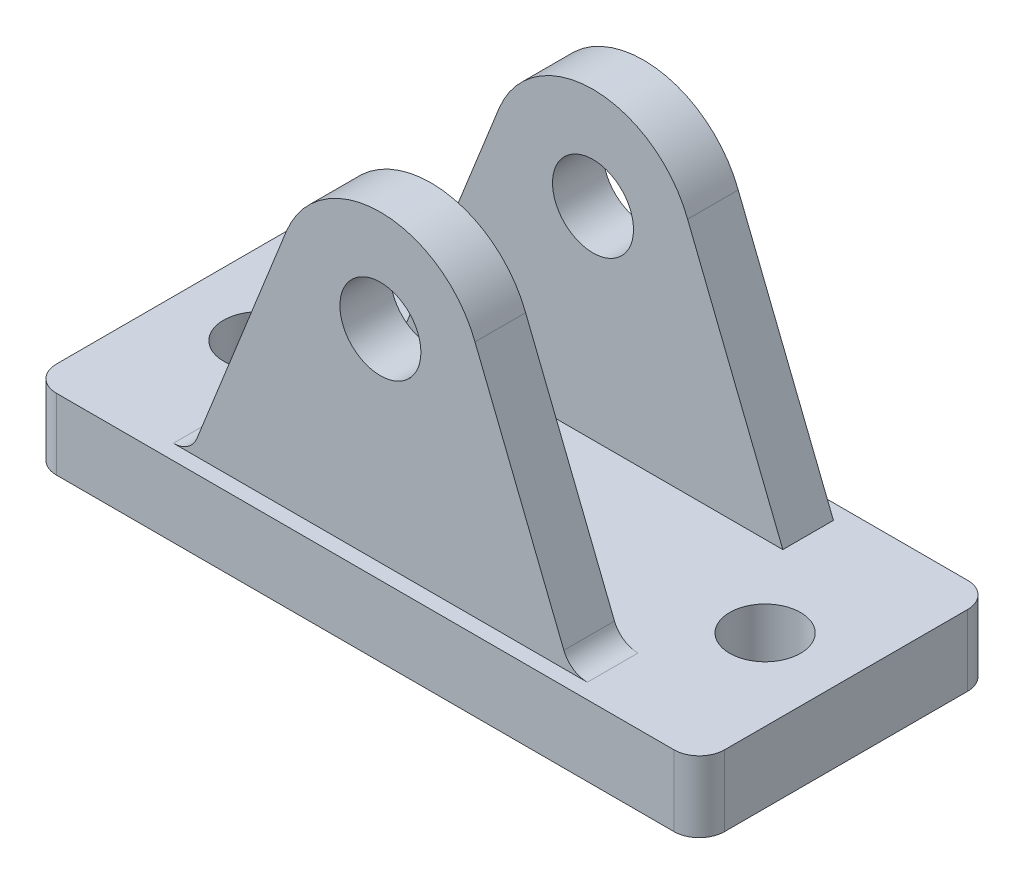
ISO-10303-21;
HEADER;
FILE_DESCRIPTION(('STEP AP214'),'2;1');
FILE_NAME('part.step','',(''),(''),'','','');
FILE_SCHEMA(('AUTOMOTIVE_DESIGN { 1 0 10303 214 1 1 1 1 }'));
ENDSEC;
DATA;
#1=APPLICATION_CONTEXT('core data for automotive mechanical design processes');
#2=APPLICATION_PROTOCOL_DEFINITION('international standard','automotive_design',2000,#1);
#3=PRODUCT_CONTEXT('',#1,'mechanical');
#4=PRODUCT('Part','Part','',(#3));
#5=PRODUCT_RELATED_PRODUCT_CATEGORY('part','',(#4));
#6=PRODUCT_DEFINITION_FORMATION('','',#4);
#7=PRODUCT_DEFINITION_CONTEXT('part definition',#1,'design');
#8=PRODUCT_DEFINITION('design','',#6,#7);
#9=PRODUCT_DEFINITION_SHAPE('','',#8);
#10=(LENGTH_UNIT() NAMED_UNIT(*) SI_UNIT(.MILLI.,.METRE.));
#11=(NAMED_UNIT(*) PLANE_ANGLE_UNIT() SI_UNIT($,.RADIAN.));
#12=(NAMED_UNIT(*) SI_UNIT($,.STERADIAN.) SOLID_ANGLE_UNIT());
#13=UNCERTAINTY_MEASURE_WITH_UNIT(LENGTH_MEASURE(1.E-05),#10,'distance_accuracy_value','');
#14=(GEOMETRIC_REPRESENTATION_CONTEXT(3) GLOBAL_UNCERTAINTY_ASSIGNED_CONTEXT((#13)) GLOBAL_UNIT_ASSIGNED_CONTEXT((#10,
#11,#12)) REPRESENTATION_CONTEXT('',''));
#15=CARTESIAN_POINT('',(0.,0.,0.));
#16=DIRECTION('',(0.,0.,1.));
#17=DIRECTION('',(1.,0.,0.));
#18=AXIS2_PLACEMENT_3D('',#15,#16,#17);
#19=CARTESIAN_POINT('',(-13.2258064516129,14.,-40.4032258064516));
#20=DIRECTION('',(0.,-1.,0.));
#21=DIRECTION('',(0.,0.,-1.));
#22=AXIS2_PLACEMENT_3D('',#19,#20,#21);
#23=PLANE('',#22);
#24=DIRECTION('',(0.,0.,1.));
#25=VECTOR('',#24,1.);
#26=CARTESIAN_POINT('',(-33.3381224883654,14.,9.59677419354839));
#27=LINE('',#26,#25);
#28=CARTESIAN_POINT('',(-33.3381224883654,14.,-0.403225806451609));
#29=VERTEX_POINT('',#28);
#30=CARTESIAN_POINT('',(-33.3381224883654,14.,9.59677419354839));
#31=VERTEX_POINT('',#30);
#32=EDGE_CURVE('E375',#29,#31,#27,.T.);
#33=ORIENTED_EDGE('',*,*,#32,.T.);
#34=DIRECTION('',(-1.,0.,0.));
#35=VECTOR('',#34,1.);
#36=CARTESIAN_POINT('',(0.,14.,9.59677419354839));
#37=LINE('',#36,#35);
#38=CARTESIAN_POINT('',(-115.113667612027,14.,9.59677419354839));
#39=VERTEX_POINT('',#38);
#40=EDGE_CURVE('E236',#31,#39,#37,.T.);
#41=ORIENTED_EDGE('',*,*,#40,.T.);
#42=DIRECTION('',(0.,0.,1.));
#43=VECTOR('',#42,1.);
#44=CARTESIAN_POINT('',(-115.113667612027,14.,-40.4032258064516));
#45=LINE('',#44,#43);
#46=CARTESIAN_POINT('',(-115.113667612027,14.,-0.403225806451609));
#47=VERTEX_POINT('',#46);
#48=EDGE_CURVE('E371',#39,#47,#45,.F.);
#49=ORIENTED_EDGE('',*,*,#48,.T.);
#50=DIRECTION('',(-1.,0.,0.));
#51=VECTOR('',#50,1.);
#52=CARTESIAN_POINT('',(0.,14.,-0.403225806451609));
#53=LINE('',#52,#51);
#54=EDGE_CURVE('E247',#29,#47,#53,.T.);
#55=ORIENTED_EDGE('',*,*,#54,.F.);
#56=EDGE_LOOP('',(#33,#41,#49,#55));
#57=FACE_BOUND('',#56,.T.);
#58=CARTESIAN_POINT('',(-13.2258064516129,14.,-40.4032258064516));
#59=DIRECTION('',(0.,1.,0.));
#60=DIRECTION('',(0.,0.,-1.));
#61=AXIS2_PLACEMENT_3D('',#58,#59,#60);
#62=CIRCLE('',#61,5.);
#63=CARTESIAN_POINT('',(-8.22580645161291,14.,-40.4032258064516));
#64=VERTEX_POINT('',#63);
#65=CARTESIAN_POINT('',(-13.2258064516129,14.,-45.4032258064516));
#66=VERTEX_POINT('',#65);
#67=EDGE_CURVE('E290',#64,#66,#62,.T.);
#68=ORIENTED_EDGE('',*,*,#67,.T.);
#69=DIRECTION('',(-1.,0.,0.));
#70=VECTOR('',#69,1.);
#71=CARTESIAN_POINT('',(-135.225806451613,14.,-45.4032258064516));
#72=LINE('',#71,#70);
#73=CARTESIAN_POINT('',(-135.225806451613,14.,-45.4032258064516));
#74=VERTEX_POINT('',#73);
#75=EDGE_CURVE('E294',#66,#74,#72,.T.);
#76=ORIENTED_EDGE('',*,*,#75,.T.);
#77=CARTESIAN_POINT('',(-135.225806451613,14.,-40.4032258064516));
#78=DIRECTION('',(0.,1.,0.));
#79=DIRECTION('',(0.,0.,1.));
#80=AXIS2_PLACEMENT_3D('',#77,#78,#79);
#81=CIRCLE('',#80,5.);
#82=CARTESIAN_POINT('',(-140.225806451613,14.,-40.4032258064516));
#83=VERTEX_POINT('',#82);
#84=EDGE_CURVE('E298',#74,#83,#81,.T.);
#85=ORIENTED_EDGE('',*,*,#84,.T.);
#86=DIRECTION('',(0.,0.,1.));
#87=VECTOR('',#86,1.);
#88=CARTESIAN_POINT('',(-140.225806451613,14.,-40.4032258064516));
#89=LINE('',#88,#87);
#90=CARTESIAN_POINT('',(-140.225806451613,14.,7.59677419354836));
#91=VERTEX_POINT('',#90);
#92=EDGE_CURVE('E301',#83,#91,#89,.T.);
#93=ORIENTED_EDGE('',*,*,#92,.T.);
#94=CARTESIAN_POINT('',(-135.225806451613,14.,7.59677419354839));
#95=DIRECTION('',(0.,1.,0.));
#96=DIRECTION('',(0.,0.,1.));
#97=AXIS2_PLACEMENT_3D('',#94,#95,#96);
#98=CIRCLE('',#97,5.);
#99=CARTESIAN_POINT('',(-135.225806451613,14.,12.5967741935484));
#100=VERTEX_POINT('',#99);
#101=EDGE_CURVE('E304',#91,#100,#98,.T.);
#102=ORIENTED_EDGE('',*,*,#101,.T.);
#103=DIRECTION('',(1.,0.,0.));
#104=VECTOR('',#103,1.);
#105=CARTESIAN_POINT('',(-135.225806451613,14.,12.5967741935484));
#106=LINE('',#105,#104);
#107=CARTESIAN_POINT('',(-13.2258064516129,14.,12.5967741935484));
#108=VERTEX_POINT('',#107);
#109=EDGE_CURVE('E307',#100,#108,#106,.T.);
#110=ORIENTED_EDGE('',*,*,#109,.T.);
#111=CARTESIAN_POINT('',(-13.2258064516129,14.,7.59677419354839));
#112=DIRECTION('',(0.,1.,0.));
#113=DIRECTION('',(0.,0.,1.));
#114=AXIS2_PLACEMENT_3D('',#111,#112,#113);
#115=CIRCLE('',#114,5.);
#116=CARTESIAN_POINT('',(-8.2258064516129,14.,7.59677419354836));
#117=VERTEX_POINT('',#116);
#118=EDGE_CURVE('E310',#108,#117,#115,.T.);
#119=ORIENTED_EDGE('',*,*,#118,.T.);
#120=DIRECTION('',(0.,0.,-1.));
#121=VECTOR('',#120,1.);
#122=CARTESIAN_POINT('',(-8.22580645161291,14.,-40.4032258064516));
#123=LINE('',#122,#121);
#124=EDGE_CURVE('E313',#117,#64,#123,.T.);
#125=ORIENTED_EDGE('',*,*,#124,.T.);
#126=EDGE_LOOP('',(#68,#76,#85,#93,#102,#110,#119,#125));
#127=FACE_BOUND('',#126,.T.);
#128=CARTESIAN_POINT('',(-124.225806451613,14.,-16.4032258064516));
#129=DIRECTION('',(0.,1.,0.));
#130=DIRECTION('',(0.,0.,1.));
#131=AXIS2_PLACEMENT_3D('',#128,#129,#130);
#132=CIRCLE('',#131,7.);
#133=CARTESIAN_POINT('',(-124.225806451613,14.,-9.40322580645162));
#134=VERTEX_POINT('',#133);
#135=EDGE_CURVE('E282',#134,#134,#132,.T.);
#136=ORIENTED_EDGE('',*,*,#135,.F.);
#137=EDGE_LOOP('',(#136));
#138=FACE_BOUND('',#137,.T.);
#139=CARTESIAN_POINT('',(-24.2258064516129,14.,-16.4032258064516));
#140=DIRECTION('',(0.,1.,0.));
#141=DIRECTION('',(0.,0.,1.));
#142=AXIS2_PLACEMENT_3D('',#139,#140,#141);
#143=CIRCLE('',#142,7.);
#144=CARTESIAN_POINT('',(-24.2258064516129,14.,-9.40322580645162));
#145=VERTEX_POINT('',#144);
#146=EDGE_CURVE('E274',#145,#145,#143,.T.);
#147=ORIENTED_EDGE('',*,*,#146,.F.);
#148=EDGE_LOOP('',(#147));
#149=FACE_BOUND('',#148,.T.);
#150=DIRECTION('',(-1.,0.,0.));
#151=VECTOR('',#150,1.);
#152=CARTESIAN_POINT('',(0.,14.,-42.4032258064516));
#153=LINE('',#152,#151);
#154=CARTESIAN_POINT('',(-36.7258064516129,14.,-42.4032258064516));
#155=VERTEX_POINT('',#154);
#156=CARTESIAN_POINT('',(-111.725806451613,14.,-42.4032258064516));
#157=VERTEX_POINT('',#156);
#158=EDGE_CURVE('E184',#155,#157,#153,.T.);
#159=ORIENTED_EDGE('',*,*,#158,.F.);
#160=DIRECTION('',(0.,0.,1.));
#161=VECTOR('',#160,1.);
#162=CARTESIAN_POINT('',(-36.7258064516129,14.,-42.4032258064516));
#163=LINE('',#162,#161);
#164=CARTESIAN_POINT('',(-36.7258064516129,14.,-32.4032258064516));
#165=VERTEX_POINT('',#164);
#166=EDGE_CURVE('E190',#155,#165,#163,.T.);
#167=ORIENTED_EDGE('',*,*,#166,.T.);
#168=DIRECTION('',(-1.,0.,0.));
#169=VECTOR('',#168,1.);
#170=CARTESIAN_POINT('',(0.,14.,-32.4032258064516));
#171=LINE('',#170,#169);
#172=CARTESIAN_POINT('',(-111.725806451613,14.,-32.4032258064516));
#173=VERTEX_POINT('',#172);
#174=EDGE_CURVE('E219',#165,#173,#171,.T.);
#175=ORIENTED_EDGE('',*,*,#174,.T.);
#176=DIRECTION('',(0.,0.,1.));
#177=VECTOR('',#176,1.);
#178=CARTESIAN_POINT('',(-111.725806451613,14.,-42.4032258064516));
#179=LINE('',#178,#177);
#180=EDGE_CURVE('E226',#157,#173,#179,.T.);
#181=ORIENTED_EDGE('',*,*,#180,.F.);
#182=EDGE_LOOP('',(#159,#167,#175,#181));
#183=FACE_BOUND('',#182,.T.);
#184=ADVANCED_FACE('F47',(#57,#127,#138,#149,#183),#23,.F.);
#185=CARTESIAN_POINT('',(-13.2258064516129,0.,-40.4032258064516));
#186=DIRECTION('',(0.,-1.,0.));
#187=DIRECTION('',(0.,0.,-1.));
#188=AXIS2_PLACEMENT_3D('',#185,#186,#187);
#189=PLANE('',#188);
#190=CARTESIAN_POINT('',(-124.225806451613,0.,-16.4032258064516));
#191=DIRECTION('',(0.,1.,0.));
#192=DIRECTION('',(0.,0.,1.));
#193=AXIS2_PLACEMENT_3D('',#190,#191,#192);
#194=CIRCLE('',#193,7.);
#195=CARTESIAN_POINT('',(-124.225806451613,0.,-9.40322580645162));
#196=VERTEX_POINT('',#195);
#197=EDGE_CURVE('E278',#196,#196,#194,.T.);
#198=ORIENTED_EDGE('',*,*,#197,.T.);
#199=EDGE_LOOP('',(#198));
#200=FACE_BOUND('',#199,.T.);
#201=CARTESIAN_POINT('',(-13.2258064516129,0.,-40.4032258064516));
#202=DIRECTION('',(0.,1.,0.));
#203=DIRECTION('',(0.,0.,-1.));
#204=AXIS2_PLACEMENT_3D('',#201,#202,#203);
#205=CIRCLE('',#204,5.);
#206=CARTESIAN_POINT('',(-8.22580645161291,0.,-40.4032258064516));
#207=VERTEX_POINT('',#206);
#208=CARTESIAN_POINT('',(-13.2258064516129,0.,-45.4032258064516));
#209=VERTEX_POINT('',#208);
#210=EDGE_CURVE('E286',#207,#209,#205,.T.);
#211=ORIENTED_EDGE('',*,*,#210,.F.);
#212=DIRECTION('',(0.,0.,-1.));
#213=VECTOR('',#212,1.);
#214=CARTESIAN_POINT('',(-8.22580645161291,0.,-40.4032258064516));
#215=LINE('',#214,#213);
#216=CARTESIAN_POINT('',(-8.2258064516129,0.,7.59677419354836));
#217=VERTEX_POINT('',#216);
#218=EDGE_CURVE('E295',#217,#207,#215,.T.);
#219=ORIENTED_EDGE('',*,*,#218,.F.);
#220=CARTESIAN_POINT('',(-13.2258064516129,0.,7.59677419354839));
#221=DIRECTION('',(0.,1.,0.));
#222=DIRECTION('',(0.,0.,1.));
#223=AXIS2_PLACEMENT_3D('',#220,#221,#222);
#224=CIRCLE('',#223,5.);
#225=CARTESIAN_POINT('',(-13.2258064516129,0.,12.5967741935484));
#226=VERTEX_POINT('',#225);
#227=EDGE_CURVE('E335',#226,#217,#224,.T.);
#228=ORIENTED_EDGE('',*,*,#227,.F.);
#229=DIRECTION('',(1.,0.,0.));
#230=VECTOR('',#229,1.);
#231=CARTESIAN_POINT('',(-135.225806451613,0.,12.5967741935484));
#232=LINE('',#231,#230);
#233=CARTESIAN_POINT('',(-135.225806451613,0.,12.5967741935484));
#234=VERTEX_POINT('',#233);
#235=EDGE_CURVE('E332',#234,#226,#232,.T.);
#236=ORIENTED_EDGE('',*,*,#235,.F.);
#237=CARTESIAN_POINT('',(-135.225806451613,0.,7.59677419354839));
#238=DIRECTION('',(0.,1.,0.));
#239=DIRECTION('',(0.,0.,1.));
#240=AXIS2_PLACEMENT_3D('',#237,#238,#239);
#241=CIRCLE('',#240,5.);
#242=CARTESIAN_POINT('',(-140.225806451613,0.,7.59677419354836));
#243=VERTEX_POINT('',#242);
#244=EDGE_CURVE('E329',#243,#234,#241,.T.);
#245=ORIENTED_EDGE('',*,*,#244,.F.);
#246=DIRECTION('',(0.,0.,1.));
#247=VECTOR('',#246,1.);
#248=CARTESIAN_POINT('',(-140.225806451613,0.,-40.4032258064516));
#249=LINE('',#248,#247);
#250=CARTESIAN_POINT('',(-140.225806451613,0.,-40.4032258064516));
#251=VERTEX_POINT('',#250);
#252=EDGE_CURVE('E326',#251,#243,#249,.T.);
#253=ORIENTED_EDGE('',*,*,#252,.F.);
#254=CARTESIAN_POINT('',(-135.225806451613,0.,-40.4032258064516));
#255=DIRECTION('',(0.,1.,0.));
#256=DIRECTION('',(0.,0.,1.));
#257=AXIS2_PLACEMENT_3D('',#254,#255,#256);
#258=CIRCLE('',#257,5.);
#259=CARTESIAN_POINT('',(-135.225806451613,0.,-45.4032258064516));
#260=VERTEX_POINT('',#259);
#261=EDGE_CURVE('E323',#260,#251,#258,.T.);
#262=ORIENTED_EDGE('',*,*,#261,.F.);
#263=DIRECTION('',(-1.,0.,0.));
#264=VECTOR('',#263,1.);
#265=CARTESIAN_POINT('',(-135.225806451613,0.,-45.4032258064516));
#266=LINE('',#265,#264);
#267=EDGE_CURVE('E320',#209,#260,#266,.T.);
#268=ORIENTED_EDGE('',*,*,#267,.F.);
#269=EDGE_LOOP('',(#211,#219,#228,#236,#245,#253,#262,#268));
#270=FACE_BOUND('',#269,.T.);
#271=CARTESIAN_POINT('',(-24.2258064516129,0.,-16.4032258064516));
#272=DIRECTION('',(0.,1.,0.));
#273=DIRECTION('',(0.,0.,1.));
#274=AXIS2_PLACEMENT_3D('',#271,#272,#273);
#275=CIRCLE('',#274,7.);
#276=CARTESIAN_POINT('',(-24.2258064516129,0.,-9.40322580645162));
#277=VERTEX_POINT('',#276);
#278=EDGE_CURVE('E271',#277,#277,#275,.T.);
#279=ORIENTED_EDGE('',*,*,#278,.T.);
#280=EDGE_LOOP('',(#279));
#281=FACE_BOUND('',#280,.T.);
#282=ADVANCED_FACE('F433',(#200,#270,#281),#189,.T.);
#283=CARTESIAN_POINT('',(-13.2258064516129,14.,-40.4032258064516));
#284=DIRECTION('',(0.,-1.,0.));
#285=DIRECTION('',(0.,0.,-1.));
#286=AXIS2_PLACEMENT_3D('',#283,#284,#285);
#287=CYLINDRICAL_SURFACE('',#286,5.);
#288=ORIENTED_EDGE('',*,*,#210,.T.);
#289=DIRECTION('',(0.,-1.,0.));
#290=VECTOR('',#289,1.);
#291=CARTESIAN_POINT('',(-13.2258064516129,14.,-45.4032258064516));
#292=LINE('',#291,#290);
#293=EDGE_CURVE('E367',#66,#209,#292,.T.);
#294=ORIENTED_EDGE('',*,*,#293,.F.);
#295=ORIENTED_EDGE('',*,*,#67,.F.);
#296=DIRECTION('',(0.,-1.,0.));
#297=VECTOR('',#296,1.);
#298=CARTESIAN_POINT('',(-8.22580645161291,14.,-40.4032258064516));
#299=LINE('',#298,#297);
#300=EDGE_CURVE('E316',#64,#207,#299,.T.);
#301=ORIENTED_EDGE('',*,*,#300,.T.);
#302=EDGE_LOOP('',(#288,#294,#295,#301));
#303=FACE_BOUND('',#302,.T.);
#304=ADVANCED_FACE('F440',(#303),#287,.T.);
#305=CARTESIAN_POINT('',(-135.225806451613,14.,-45.4032258064516));
#306=DIRECTION('',(0.,0.,1.));
#307=DIRECTION('',(1.,0.,0.));
#308=AXIS2_PLACEMENT_3D('',#305,#306,#307);
#309=PLANE('',#308);
#310=ORIENTED_EDGE('',*,*,#267,.T.);
#311=DIRECTION('',(0.,-1.,0.));
#312=VECTOR('',#311,1.);
#313=CARTESIAN_POINT('',(-135.225806451613,14.,-45.4032258064516));
#314=LINE('',#313,#312);
#315=EDGE_CURVE('E363',#74,#260,#314,.T.);
#316=ORIENTED_EDGE('',*,*,#315,.F.);
#317=ORIENTED_EDGE('',*,*,#75,.F.);
#318=ORIENTED_EDGE('',*,*,#293,.T.);
#319=EDGE_LOOP('',(#310,#316,#317,#318));
#320=FACE_BOUND('',#319,.T.);
#321=ADVANCED_FACE('F470',(#320),#309,.F.);
#322=CARTESIAN_POINT('',(-135.225806451613,14.,-40.4032258064516));
#323=DIRECTION('',(0.,-1.,0.));
#324=DIRECTION('',(0.,0.,-1.));
#325=AXIS2_PLACEMENT_3D('',#322,#323,#324);
#326=CYLINDRICAL_SURFACE('',#325,5.);
#327=ORIENTED_EDGE('',*,*,#261,.T.);
#328=DIRECTION('',(0.,-1.,0.));
#329=VECTOR('',#328,1.);
#330=CARTESIAN_POINT('',(-140.225806451613,14.,-40.4032258064516));
#331=LINE('',#330,#329);
#332=EDGE_CURVE('E359',#83,#251,#331,.T.);
#333=ORIENTED_EDGE('',*,*,#332,.F.);
#334=ORIENTED_EDGE('',*,*,#84,.F.);
#335=ORIENTED_EDGE('',*,*,#315,.T.);
#336=EDGE_LOOP('',(#327,#333,#334,#335));
#337=FACE_BOUND('',#336,.T.);
#338=ADVANCED_FACE('F466',(#337),#326,.T.);
#339=CARTESIAN_POINT('',(-140.225806451613,14.,-40.4032258064516));
#340=DIRECTION('',(1.,0.,0.));
#341=DIRECTION('',(0.,0.,-1.));
#342=AXIS2_PLACEMENT_3D('',#339,#340,#341);
#343=PLANE('',#342);
#344=ORIENTED_EDGE('',*,*,#252,.T.);
#345=DIRECTION('',(0.,-1.,0.));
#346=VECTOR('',#345,1.);
#347=CARTESIAN_POINT('',(-140.225806451613,14.,7.59677419354836));
#348=LINE('',#347,#346);
#349=EDGE_CURVE('E355',#91,#243,#348,.T.);
#350=ORIENTED_EDGE('',*,*,#349,.F.);
#351=ORIENTED_EDGE('',*,*,#92,.F.);
#352=ORIENTED_EDGE('',*,*,#332,.T.);
#353=EDGE_LOOP('',(#344,#350,#351,#352));
#354=FACE_BOUND('',#353,.T.);
#355=ADVANCED_FACE('F462',(#354),#343,.F.);
#356=CARTESIAN_POINT('',(-135.225806451613,14.,7.59677419354839));
#357=DIRECTION('',(0.,-1.,0.));
#358=DIRECTION('',(0.,0.,-1.));
#359=AXIS2_PLACEMENT_3D('',#356,#357,#358);
#360=CYLINDRICAL_SURFACE('',#359,5.);
#361=ORIENTED_EDGE('',*,*,#244,.T.);
#362=DIRECTION('',(0.,-1.,0.));
#363=VECTOR('',#362,1.);
#364=CARTESIAN_POINT('',(-135.225806451613,14.,12.5967741935484));
#365=LINE('',#364,#363);
#366=EDGE_CURVE('E351',#100,#234,#365,.T.);
#367=ORIENTED_EDGE('',*,*,#366,.F.);
#368=ORIENTED_EDGE('',*,*,#101,.F.);
#369=ORIENTED_EDGE('',*,*,#349,.T.);
#370=EDGE_LOOP('',(#361,#367,#368,#369));
#371=FACE_BOUND('',#370,.T.);
#372=ADVANCED_FACE('F458',(#371),#360,.T.);
#373=CARTESIAN_POINT('',(-135.225806451613,14.,12.5967741935484));
#374=DIRECTION('',(0.,0.,-1.));
#375=DIRECTION('',(-1.,0.,0.));
#376=AXIS2_PLACEMENT_3D('',#373,#374,#375);
#377=PLANE('',#376);
#378=ORIENTED_EDGE('',*,*,#235,.T.);
#379=DIRECTION('',(0.,-1.,0.));
#380=VECTOR('',#379,1.);
#381=CARTESIAN_POINT('',(-13.2258064516129,14.,12.5967741935484));
#382=LINE('',#381,#380);
#383=EDGE_CURVE('E347',#108,#226,#382,.T.);
#384=ORIENTED_EDGE('',*,*,#383,.F.);
#385=ORIENTED_EDGE('',*,*,#109,.F.);
#386=ORIENTED_EDGE('',*,*,#366,.T.);
#387=EDGE_LOOP('',(#378,#384,#385,#386));
#388=FACE_BOUND('',#387,.T.);
#389=ADVANCED_FACE('F454',(#388),#377,.F.);
#390=CARTESIAN_POINT('',(-13.2258064516129,14.,7.59677419354839));
#391=DIRECTION('',(0.,-1.,0.));
#392=DIRECTION('',(0.,0.,-1.));
#393=AXIS2_PLACEMENT_3D('',#390,#391,#392);
#394=CYLINDRICAL_SURFACE('',#393,5.);
#395=ORIENTED_EDGE('',*,*,#227,.T.);
#396=DIRECTION('',(0.,-1.,0.));
#397=VECTOR('',#396,1.);
#398=CARTESIAN_POINT('',(-8.2258064516129,14.,7.59677419354836));
#399=LINE('',#398,#397);
#400=EDGE_CURVE('E343',#117,#217,#399,.T.);
#401=ORIENTED_EDGE('',*,*,#400,.F.);
#402=ORIENTED_EDGE('',*,*,#118,.F.);
#403=ORIENTED_EDGE('',*,*,#383,.T.);
#404=EDGE_LOOP('',(#395,#401,#402,#403));
#405=FACE_BOUND('',#404,.T.);
#406=ADVANCED_FACE('F450',(#405),#394,.T.);
#407=CARTESIAN_POINT('',(-8.22580645161291,14.,-40.4032258064516));
#408=DIRECTION('',(-1.,0.,0.));
#409=DIRECTION('',(0.,0.,1.));
#410=AXIS2_PLACEMENT_3D('',#407,#408,#409);
#411=PLANE('',#410);
#412=ORIENTED_EDGE('',*,*,#218,.T.);
#413=ORIENTED_EDGE('',*,*,#300,.F.);
#414=ORIENTED_EDGE('',*,*,#124,.F.);
#415=ORIENTED_EDGE('',*,*,#400,.T.);
#416=EDGE_LOOP('',(#412,#413,#414,#415));
#417=FACE_BOUND('',#416,.T.);
#418=ADVANCED_FACE('F447',(#417),#411,.F.);
#419=CARTESIAN_POINT('',(-124.225806451613,14.,-16.4032258064516));
#420=DIRECTION('',(0.,-1.,0.));
#421=DIRECTION('',(0.,0.,-1.));
#422=AXIS2_PLACEMENT_3D('',#419,#420,#421);
#423=CYLINDRICAL_SURFACE('',#422,7.);
#424=ORIENTED_EDGE('',*,*,#135,.T.);
#425=EDGE_LOOP('',(#424));
#426=FACE_BOUND('',#425,.T.);
#427=ORIENTED_EDGE('',*,*,#197,.F.);
#428=EDGE_LOOP('',(#427));
#429=FACE_BOUND('',#428,.T.);
#430=ADVANCED_FACE('F444',(#426,#429),#423,.F.);
#431=CARTESIAN_POINT('',(-24.2258064516129,14.,-16.4032258064516));
#432=DIRECTION('',(0.,-1.,0.));
#433=DIRECTION('',(0.,0.,-1.));
#434=AXIS2_PLACEMENT_3D('',#431,#432,#433);
#435=CYLINDRICAL_SURFACE('',#434,7.);
#436=ORIENTED_EDGE('',*,*,#146,.T.);
#437=EDGE_LOOP('',(#436));
#438=FACE_BOUND('',#437,.T.);
#439=ORIENTED_EDGE('',*,*,#278,.F.);
#440=EDGE_LOOP('',(#439));
#441=FACE_BOUND('',#440,.T.);
#442=ADVANCED_FACE('F588',(#438,#441),#435,.F.);
#443=CARTESIAN_POINT('',(-26.8570832098189,-10.7213182714926,-0.403225806451609));
#444=DIRECTION('',(-0.928733021499053,-0.370749207385855,0.));
#445=DIRECTION('',(0.370749207385855,-0.928733021499053,0.));
#446=AXIS2_PLACEMENT_3D('',#443,#444,#445);
#447=PLANE('',#446);
#448=DIRECTION('',(0.370749207385855,-0.928733021499053,0.));
#449=VECTOR('',#448,1.);
#450=CARTESIAN_POINT('',(-26.8570832098189,-10.7213182714926,9.59677419354839));
#451=LINE('',#450,#449);
#452=CARTESIAN_POINT('',(-55.5366818561217,61.1215603524934,9.59677419354839));
#453=VERTEX_POINT('',#452);
#454=CARTESIAN_POINT('',(-37.9817875958607,17.1462539630707,9.59677419354839));
#455=VERTEX_POINT('',#454);
#456=EDGE_CURVE('E254',#453,#455,#451,.T.);
#457=ORIENTED_EDGE('',*,*,#456,.T.);
#458=DIRECTION('',(0.,0.,1.));
#459=VECTOR('',#458,1.);
#460=CARTESIAN_POINT('',(-37.9817875958607,17.1462539630707,-0.403225806451607));
#461=LINE('',#460,#459);
#462=CARTESIAN_POINT('',(-37.9817875958607,17.1462539630707,-0.403225806451609));
#463=VERTEX_POINT('',#462);
#464=EDGE_CURVE('E379',#455,#463,#461,.F.);
#465=ORIENTED_EDGE('',*,*,#464,.T.);
#466=DIRECTION('',(0.370749207385855,-0.928733021499053,0.));
#467=VECTOR('',#466,1.);
#468=CARTESIAN_POINT('',(-26.8570832098189,-10.7213182714926,-0.403225806451609));
#469=LINE('',#468,#467);
#470=CARTESIAN_POINT('',(-55.5366818561217,61.1215603524934,-0.403225806451609));
#471=VERTEX_POINT('',#470);
#472=EDGE_CURVE('E235',#471,#463,#469,.T.);
#473=ORIENTED_EDGE('',*,*,#472,.F.);
#474=DIRECTION('',(0.,0.,1.));
#475=VECTOR('',#474,1.);
#476=CARTESIAN_POINT('',(-55.5366818561217,61.1215603524934,-0.403225806451609));
#477=LINE('',#476,#475);
#478=EDGE_CURVE('E250',#471,#453,#477,.T.);
#479=ORIENTED_EDGE('',*,*,#478,.T.);
#480=EDGE_LOOP('',(#457,#465,#473,#479));
#481=FACE_BOUND('',#480,.T.);
#482=ADVANCED_FACE('F411',(#481),#447,.F.);
#483=CARTESIAN_POINT('',(-101.192361241534,40.3901810839083,-0.403225806451609));
#484=DIRECTION('',(-0.92875103057504,0.3707040911641,0.));
#485=DIRECTION('',(-0.3707040911641,-0.92875103057504,0.));
#486=AXIS2_PLACEMENT_3D('',#483,#484,#485);
#487=PLANE('',#486);
#488=DIRECTION('',(-0.3707040911641,-0.92875103057504,0.));
#489=VECTOR('',#488,1.);
#490=CARTESIAN_POINT('',(-101.192361241534,40.3901810839083,-0.403225806451609));
#491=LINE('',#490,#489);
#492=CARTESIAN_POINT('',(-92.8008270631137,61.414081823282,-0.403225806451609));
#493=VERTEX_POINT('',#492);
#494=CARTESIAN_POINT('',(-110.469912459152,17.1464795441795,-0.403225806451609));
#495=VERTEX_POINT('',#494);
#496=EDGE_CURVE('E244',#493,#495,#491,.T.);
#497=ORIENTED_EDGE('',*,*,#496,.T.);
#498=DIRECTION('',(0.,0.,1.));
#499=VECTOR('',#498,1.);
#500=CARTESIAN_POINT('',(-110.469912459152,17.1464795441795,-0.403225806451609));
#501=LINE('',#500,#499);
#502=CARTESIAN_POINT('',(-110.469912459152,17.1464795441795,9.59677419354839));
#503=VERTEX_POINT('',#502);
#504=EDGE_CURVE('E382',#495,#503,#501,.T.);
#505=ORIENTED_EDGE('',*,*,#504,.T.);
#506=DIRECTION('',(-0.3707040911641,-0.92875103057504,0.));
#507=VECTOR('',#506,1.);
#508=CARTESIAN_POINT('',(-101.192361241534,40.3901810839083,9.59677419354839));
#509=LINE('',#508,#507);
#510=CARTESIAN_POINT('',(-92.8008270631137,61.414081823282,9.59677419354839));
#511=VERTEX_POINT('',#510);
#512=EDGE_CURVE('E262',#511,#503,#509,.T.);
#513=ORIENTED_EDGE('',*,*,#512,.F.);
#514=DIRECTION('',(0.,0.,1.));
#515=VECTOR('',#514,1.);
#516=CARTESIAN_POINT('',(-92.8008270631137,61.414081823282,-0.403225806451609));
#517=LINE('',#516,#515);
#518=EDGE_CURVE('E268',#493,#511,#517,.T.);
#519=ORIENTED_EDGE('',*,*,#518,.F.);
#520=EDGE_LOOP('',(#497,#505,#513,#519));
#521=FACE_BOUND('',#520,.T.);
#522=ADVANCED_FACE('F417',(#521),#487,.T.);
#523=CARTESIAN_POINT('',(-74.2258064516129,54.,-0.403225806451609));
#524=DIRECTION('',(0.,0.,1.));
#525=DIRECTION('',(1.,0.,0.));
#526=AXIS2_PLACEMENT_3D('',#523,#524,#525);
#527=CYLINDRICAL_SURFACE('',#526,8.00000000000001);
#528=CARTESIAN_POINT('',(-74.2258064516129,54.,-0.403225806451609));
#529=DIRECTION('',(0.,0.,1.));
#530=DIRECTION('',(1.,0.,0.));
#531=AXIS2_PLACEMENT_3D('',#528,#529,#530);
#532=CIRCLE('',#531,8.00000000000001);
#533=CARTESIAN_POINT('',(-66.2258064516129,54.,-0.403225806451609));
#534=VERTEX_POINT('',#533);
#535=EDGE_CURVE('E231',#534,#534,#532,.T.);
#536=ORIENTED_EDGE('',*,*,#535,.F.);
#537=EDGE_LOOP('',(#536));
#538=FACE_BOUND('',#537,.T.);
#539=CARTESIAN_POINT('',(-74.2258064516129,54.,9.59677419354839));
#540=DIRECTION('',(0.,0.,1.));
#541=DIRECTION('',(1.,0.,0.));
#542=AXIS2_PLACEMENT_3D('',#539,#540,#541);
#543=CIRCLE('',#542,8.00000000000001);
#544=CARTESIAN_POINT('',(-66.2258064516129,54.,9.59677419354839));
#545=VERTEX_POINT('',#544);
#546=EDGE_CURVE('E225',#545,#545,#543,.T.);
#547=ORIENTED_EDGE('',*,*,#546,.T.);
#548=EDGE_LOOP('',(#547));
#549=FACE_BOUND('',#548,.T.);
#550=ADVANCED_FACE('F429',(#538,#549),#527,.F.);
#551=CARTESIAN_POINT('',(-74.2258064516129,54.,-0.403225806451609));
#552=DIRECTION('',(0.,0.,1.));
#553=DIRECTION('',(1.,0.,0.));
#554=AXIS2_PLACEMENT_3D('',#551,#552,#553);
#555=CYLINDRICAL_SURFACE('',#554,20.);
#556=CARTESIAN_POINT('',(-74.2258064516129,54.,9.59677419354839));
#557=DIRECTION('',(0.,0.,1.));
#558=DIRECTION('',(1.,0.,0.));
#559=AXIS2_PLACEMENT_3D('',#556,#557,#558);
#560=CIRCLE('',#559,20.);
#561=EDGE_CURVE('E258',#453,#511,#560,.T.);
#562=ORIENTED_EDGE('',*,*,#561,.F.);
#563=ORIENTED_EDGE('',*,*,#478,.F.);
#564=CARTESIAN_POINT('',(-74.2258064516129,54.,-0.403225806451609));
#565=DIRECTION('',(0.,0.,1.));
#566=DIRECTION('',(1.,0.,0.));
#567=AXIS2_PLACEMENT_3D('',#564,#565,#566);
#568=CIRCLE('',#567,20.);
#569=EDGE_CURVE('E240',#471,#493,#568,.T.);
#570=ORIENTED_EDGE('',*,*,#569,.T.);
#571=ORIENTED_EDGE('',*,*,#518,.T.);
#572=EDGE_LOOP('',(#562,#563,#570,#571));
#573=FACE_BOUND('',#572,.T.);
#574=ADVANCED_FACE('F415',(#573),#555,.T.);
#575=CARTESIAN_POINT('',(0.,0.,-0.403225806451609));
#576=DIRECTION('',(0.,0.,1.));
#577=DIRECTION('',(1.,0.,0.));
#578=AXIS2_PLACEMENT_3D('',#575,#576,#577);
#579=PLANE('',#578);
#580=ORIENTED_EDGE('',*,*,#535,.T.);
#581=EDGE_LOOP('',(#580));
#582=FACE_BOUND('',#581,.T.);
#583=ORIENTED_EDGE('',*,*,#472,.T.);
#584=CARTESIAN_POINT('',(-33.3381224883654,19.,-0.403225806451607));
#585=DIRECTION('',(0.,0.,1.));
#586=DIRECTION('',(1.,0.,0.));
#587=AXIS2_PLACEMENT_3D('',#584,#585,#586);
#588=CIRCLE('',#587,5.);
#589=EDGE_CURVE('E389',#463,#29,#588,.T.);
#590=ORIENTED_EDGE('',*,*,#589,.T.);
#591=ORIENTED_EDGE('',*,*,#54,.T.);
#592=CARTESIAN_POINT('',(-115.113667612027,19.,-0.403225806451609));
#593=DIRECTION('',(0.,0.,1.));
#594=DIRECTION('',(1.,0.,0.));
#595=AXIS2_PLACEMENT_3D('',#592,#593,#594);
#596=CIRCLE('',#595,5.);
#597=EDGE_CURVE('E11',#47,#495,#596,.T.);
#598=ORIENTED_EDGE('',*,*,#597,.T.);
#599=ORIENTED_EDGE('',*,*,#496,.F.);
#600=ORIENTED_EDGE('',*,*,#569,.F.);
#601=EDGE_LOOP('',(#583,#590,#591,#598,#599,#600));
#602=FACE_BOUND('',#601,.T.);
#603=ADVANCED_FACE('F418',(#582,#602),#579,.F.);
#604=CARTESIAN_POINT('',(0.,0.,9.59677419354839));
#605=DIRECTION('',(0.,0.,1.));
#606=DIRECTION('',(1.,0.,0.));
#607=AXIS2_PLACEMENT_3D('',#604,#605,#606);
#608=PLANE('',#607);
#609=ORIENTED_EDGE('',*,*,#546,.F.);
#610=EDGE_LOOP('',(#609));
#611=FACE_BOUND('',#610,.T.);
#612=ORIENTED_EDGE('',*,*,#456,.F.);
#613=ORIENTED_EDGE('',*,*,#561,.T.);
#614=ORIENTED_EDGE('',*,*,#512,.T.);
#615=CARTESIAN_POINT('',(-115.113667612027,19.,9.59677419354839));
#616=DIRECTION('',(0.,0.,1.));
#617=DIRECTION('',(1.,0.,0.));
#618=AXIS2_PLACEMENT_3D('',#615,#616,#617);
#619=CIRCLE('',#618,5.);
#620=EDGE_CURVE('E56',#503,#39,#619,.F.);
#621=ORIENTED_EDGE('',*,*,#620,.T.);
#622=ORIENTED_EDGE('',*,*,#40,.F.);
#623=CARTESIAN_POINT('',(-33.3381224883654,19.,9.59677419354839));
#624=DIRECTION('',(0.,0.,1.));
#625=DIRECTION('',(1.,0.,0.));
#626=AXIS2_PLACEMENT_3D('',#623,#624,#625);
#627=CIRCLE('',#626,5.);
#628=EDGE_CURVE('E386',#31,#455,#627,.F.);
#629=ORIENTED_EDGE('',*,*,#628,.T.);
#630=EDGE_LOOP('',(#612,#613,#614,#621,#622,#629));
#631=FACE_BOUND('',#630,.T.);
#632=ADVANCED_FACE('F397',(#611,#631),#608,.T.);
#633=CARTESIAN_POINT('',(-33.3381224883654,19.,-40.4032258064516));
#634=DIRECTION('',(0.,0.,-1.));
#635=DIRECTION('',(-1.,0.,0.));
#636=AXIS2_PLACEMENT_3D('',#633,#634,#635);
#637=CYLINDRICAL_SURFACE('',#636,5.);
#638=ORIENTED_EDGE('',*,*,#589,.F.);
#639=ORIENTED_EDGE('',*,*,#464,.F.);
#640=ORIENTED_EDGE('',*,*,#628,.F.);
#641=ORIENTED_EDGE('',*,*,#32,.F.);
#642=EDGE_LOOP('',(#638,#639,#640,#641));
#643=FACE_BOUND('',#642,.T.);
#644=ADVANCED_FACE('F407',(#643),#637,.F.);
#645=CARTESIAN_POINT('',(-115.113667612027,19.,-0.403225806451609));
#646=DIRECTION('',(0.,0.,1.));
#647=DIRECTION('',(1.,0.,0.));
#648=AXIS2_PLACEMENT_3D('',#645,#646,#647);
#649=CYLINDRICAL_SURFACE('',#648,5.);
#650=ORIENTED_EDGE('',*,*,#597,.F.);
#651=ORIENTED_EDGE('',*,*,#48,.F.);
#652=ORIENTED_EDGE('',*,*,#620,.F.);
#653=ORIENTED_EDGE('',*,*,#504,.F.);
#654=EDGE_LOOP('',(#650,#651,#652,#653));
#655=FACE_BOUND('',#654,.T.);
#656=ADVANCED_FACE('F49',(#655),#649,.F.);
#657=CARTESIAN_POINT('',(-26.8570832098189,-10.7213182714926,-42.4032258064516));
#658=DIRECTION('',(-0.928733021499053,-0.370749207385855,0.));
#659=DIRECTION('',(0.370749207385855,-0.928733021499053,0.));
#660=AXIS2_PLACEMENT_3D('',#657,#658,#659);
#661=PLANE('',#660);
#662=DIRECTION('',(0.370749207385855,-0.928733021499053,0.));
#663=VECTOR('',#662,1.);
#664=CARTESIAN_POINT('',(-26.8570832098189,-10.7213182714926,-32.4032258064516));
#665=LINE('',#664,#663);
#666=CARTESIAN_POINT('',(-55.5366818561217,61.1215603524934,-32.4032258064516));
#667=VERTEX_POINT('',#666);
#668=EDGE_CURVE('E212',#667,#165,#665,.T.);
#669=ORIENTED_EDGE('',*,*,#668,.T.);
#670=ORIENTED_EDGE('',*,*,#166,.F.);
#671=DIRECTION('',(0.370749207385855,-0.928733021499053,0.));
#672=VECTOR('',#671,1.);
#673=CARTESIAN_POINT('',(-26.8570832098189,-10.7213182714926,-42.4032258064516));
#674=LINE('',#673,#672);
#675=CARTESIAN_POINT('',(-55.5366818561217,61.1215603524934,-42.4032258064516));
#676=VERTEX_POINT('',#675);
#677=EDGE_CURVE('E187',#676,#155,#674,.T.);
#678=ORIENTED_EDGE('',*,*,#677,.F.);
#679=DIRECTION('',(0.,0.,1.));
#680=VECTOR('',#679,1.);
#681=CARTESIAN_POINT('',(-55.5366818561217,61.1215603524934,-42.4032258064516));
#682=LINE('',#681,#680);
#683=EDGE_CURVE('E173',#676,#667,#682,.T.);
#684=ORIENTED_EDGE('',*,*,#683,.T.);
#685=EDGE_LOOP('',(#669,#670,#678,#684));
#686=FACE_BOUND('',#685,.T.);
#687=ADVANCED_FACE('F188',(#686),#661,.F.);
#688=CARTESIAN_POINT('',(-101.192361241534,40.3901810839083,-42.4032258064516));
#689=DIRECTION('',(-0.92875103057504,0.3707040911641,0.));
#690=DIRECTION('',(-0.3707040911641,-0.92875103057504,0.));
#691=AXIS2_PLACEMENT_3D('',#688,#689,#690);
#692=PLANE('',#691);
#693=DIRECTION('',(-0.3707040911641,-0.92875103057504,0.));
#694=VECTOR('',#693,1.);
#695=CARTESIAN_POINT('',(-101.192361241534,40.3901810839083,-32.4032258064516));
#696=LINE('',#695,#694);
#697=CARTESIAN_POINT('',(-92.8008270631137,61.414081823282,-32.4032258064516));
#698=VERTEX_POINT('',#697);
#699=EDGE_CURVE('E63',#698,#173,#696,.T.);
#700=ORIENTED_EDGE('',*,*,#699,.F.);
#701=DIRECTION('',(0.,0.,1.));
#702=VECTOR('',#701,1.);
#703=CARTESIAN_POINT('',(-92.8008270631137,61.414081823282,-42.4032258064516));
#704=LINE('',#703,#702);
#705=CARTESIAN_POINT('',(-92.8008270631137,61.414081823282,-42.4032258064516));
#706=VERTEX_POINT('',#705);
#707=EDGE_CURVE('E183',#706,#698,#704,.T.);
#708=ORIENTED_EDGE('',*,*,#707,.F.);
#709=DIRECTION('',(-0.3707040911641,-0.92875103057504,0.));
#710=VECTOR('',#709,1.);
#711=CARTESIAN_POINT('',(-101.192361241534,40.3901810839083,-42.4032258064516));
#712=LINE('',#711,#710);
#713=EDGE_CURVE('E199',#706,#157,#712,.T.);
#714=ORIENTED_EDGE('',*,*,#713,.T.);
#715=ORIENTED_EDGE('',*,*,#180,.T.);
#716=EDGE_LOOP('',(#700,#708,#714,#715));
#717=FACE_BOUND('',#716,.T.);
#718=ADVANCED_FACE('F482',(#717),#692,.T.);
#719=CARTESIAN_POINT('',(-74.2258064516129,54.,-42.4032258064516));
#720=DIRECTION('',(0.,0.,1.));
#721=DIRECTION('',(1.,0.,0.));
#722=AXIS2_PLACEMENT_3D('',#719,#720,#721);
#723=CYLINDRICAL_SURFACE('',#722,8.00000000000001);
#724=CARTESIAN_POINT('',(-74.2258064516129,54.,-42.4032258064516));
#725=DIRECTION('',(0.,0.,1.));
#726=DIRECTION('',(1.,0.,0.));
#727=AXIS2_PLACEMENT_3D('',#724,#725,#726);
#728=CIRCLE('',#727,8.00000000000001);
#729=CARTESIAN_POINT('',(-66.2258064516129,54.,-42.4032258064516));
#730=VERTEX_POINT('',#729);
#731=EDGE_CURVE('E194',#730,#730,#728,.T.);
#732=ORIENTED_EDGE('',*,*,#731,.F.);
#733=EDGE_LOOP('',(#732));
#734=FACE_BOUND('',#733,.T.);
#735=CARTESIAN_POINT('',(-74.2258064516129,54.,-32.4032258064516));
#736=DIRECTION('',(0.,0.,1.));
#737=DIRECTION('',(1.,0.,0.));
#738=AXIS2_PLACEMENT_3D('',#735,#736,#737);
#739=CIRCLE('',#738,8.00000000000001);
#740=CARTESIAN_POINT('',(-66.2258064516129,54.,-32.4032258064516));
#741=VERTEX_POINT('',#740);
#742=EDGE_CURVE('E208',#741,#741,#739,.T.);
#743=ORIENTED_EDGE('',*,*,#742,.T.);
#744=EDGE_LOOP('',(#743));
#745=FACE_BOUND('',#744,.T.);
#746=ADVANCED_FACE('F487',(#734,#745),#723,.F.);
#747=CARTESIAN_POINT('',(-74.2258064516129,54.,-42.4032258064516));
#748=DIRECTION('',(0.,0.,1.));
#749=DIRECTION('',(1.,0.,0.));
#750=AXIS2_PLACEMENT_3D('',#747,#748,#749);
#751=CYLINDRICAL_SURFACE('',#750,20.);
#752=CARTESIAN_POINT('',(-74.2258064516129,54.,-32.4032258064516));
#753=DIRECTION('',(0.,0.,1.));
#754=DIRECTION('',(1.,0.,0.));
#755=AXIS2_PLACEMENT_3D('',#752,#753,#754);
#756=CIRCLE('',#755,20.);
#757=EDGE_CURVE('E178',#667,#698,#756,.T.);
#758=ORIENTED_EDGE('',*,*,#757,.F.);
#759=ORIENTED_EDGE('',*,*,#683,.F.);
#760=CARTESIAN_POINT('',(-74.2258064516129,54.,-42.4032258064516));
#761=DIRECTION('',(0.,0.,1.));
#762=DIRECTION('',(1.,0.,0.));
#763=AXIS2_PLACEMENT_3D('',#760,#761,#762);
#764=CIRCLE('',#763,20.);
#765=EDGE_CURVE('E177',#676,#706,#764,.T.);
#766=ORIENTED_EDGE('',*,*,#765,.T.);
#767=ORIENTED_EDGE('',*,*,#707,.T.);
#768=EDGE_LOOP('',(#758,#759,#766,#767));
#769=FACE_BOUND('',#768,.T.);
#770=ADVANCED_FACE('F175',(#769),#751,.T.);
#771=CARTESIAN_POINT('',(0.,0.,-42.4032258064516));
#772=DIRECTION('',(0.,0.,1.));
#773=DIRECTION('',(1.,0.,0.));
#774=AXIS2_PLACEMENT_3D('',#771,#772,#773);
#775=PLANE('',#774);
#776=ORIENTED_EDGE('',*,*,#731,.T.);
#777=EDGE_LOOP('',(#776));
#778=FACE_BOUND('',#777,.T.);
#779=ORIENTED_EDGE('',*,*,#677,.T.);
#780=ORIENTED_EDGE('',*,*,#158,.T.);
#781=ORIENTED_EDGE('',*,*,#713,.F.);
#782=ORIENTED_EDGE('',*,*,#765,.F.);
#783=EDGE_LOOP('',(#779,#780,#781,#782));
#784=FACE_BOUND('',#783,.T.);
#785=ADVANCED_FACE('F197',(#778,#784),#775,.F.);
#786=CARTESIAN_POINT('',(0.,0.,-32.4032258064516));
#787=DIRECTION('',(0.,0.,1.));
#788=DIRECTION('',(1.,0.,0.));
#789=AXIS2_PLACEMENT_3D('',#786,#787,#788);
#790=PLANE('',#789);
#791=ORIENTED_EDGE('',*,*,#742,.F.);
#792=EDGE_LOOP('',(#791));
#793=FACE_BOUND('',#792,.T.);
#794=ORIENTED_EDGE('',*,*,#668,.F.);
#795=ORIENTED_EDGE('',*,*,#757,.T.);
#796=ORIENTED_EDGE('',*,*,#699,.T.);
#797=ORIENTED_EDGE('',*,*,#174,.F.);
#798=EDGE_LOOP('',(#794,#795,#796,#797));
#799=FACE_BOUND('',#798,.T.);
#800=ADVANCED_FACE('F501',(#793,#799),#790,.T.);
#801=CLOSED_SHELL('',(#184,#282,#304,#321,#338,#355,#372,#389,#406,#418,#430,#442,#482,#522,
#550,#574,#603,#632,#644,#656,#687,#718,#746,#770,#785,#800));
#802=MANIFOLD_SOLID_BREP('B2',#801);
#803=ADVANCED_BREP_SHAPE_REPRESENTATION('',(#18,#802),#14);
#804=SHAPE_DEFINITION_REPRESENTATION(#9,#803);
ENDSEC;
END-ISO-10303-21;
